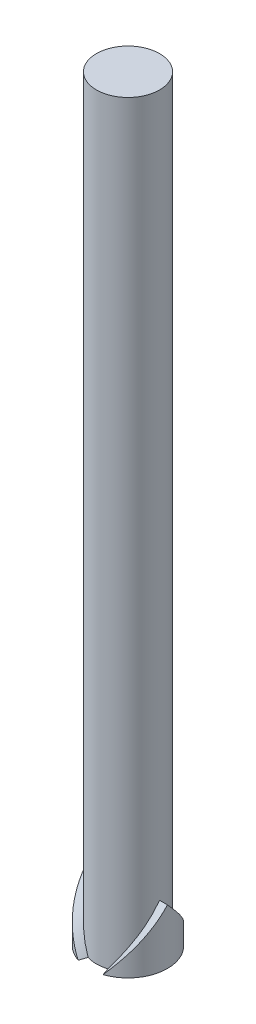
ISO-10303-21;
HEADER;
FILE_DESCRIPTION(('STEP AP214'),'2;1');
FILE_NAME('part.step','',(''),(''),'','','');
FILE_SCHEMA(('AUTOMOTIVE_DESIGN { 1 0 10303 214 1 1 1 1 }'));
ENDSEC;
DATA;
#1=APPLICATION_CONTEXT('core data for automotive mechanical design processes');
#2=APPLICATION_PROTOCOL_DEFINITION('international standard','automotive_design',2000,#1);
#3=PRODUCT_CONTEXT('',#1,'mechanical');
#4=PRODUCT('Part','Part','',(#3));
#5=PRODUCT_RELATED_PRODUCT_CATEGORY('part','',(#4));
#6=PRODUCT_DEFINITION_FORMATION('','',#4);
#7=PRODUCT_DEFINITION_CONTEXT('part definition',#1,'design');
#8=PRODUCT_DEFINITION('design','',#6,#7);
#9=PRODUCT_DEFINITION_SHAPE('','',#8);
#10=(LENGTH_UNIT() NAMED_UNIT(*) SI_UNIT(.MILLI.,.METRE.));
#11=(NAMED_UNIT(*) PLANE_ANGLE_UNIT() SI_UNIT($,.RADIAN.));
#12=(NAMED_UNIT(*) SI_UNIT($,.STERADIAN.) SOLID_ANGLE_UNIT());
#13=UNCERTAINTY_MEASURE_WITH_UNIT(LENGTH_MEASURE(1.E-05),#10,'distance_accuracy_value','');
#14=(GEOMETRIC_REPRESENTATION_CONTEXT(3) GLOBAL_UNCERTAINTY_ASSIGNED_CONTEXT((#13)) GLOBAL_UNIT_ASSIGNED_CONTEXT((#10,
#11,#12)) REPRESENTATION_CONTEXT('',''));
#15=CARTESIAN_POINT('',(0.,0.,0.));
#16=DIRECTION('',(0.,0.,1.));
#17=DIRECTION('',(1.,0.,0.));
#18=AXIS2_PLACEMENT_3D('',#15,#16,#17);
#19=CARTESIAN_POINT('',(0.,1219.2,0.));
#20=DIRECTION('',(0.,-1.,0.));
#21=DIRECTION('',(0.,0.,-1.));
#22=AXIS2_PLACEMENT_3D('',#19,#20,#21);
#23=CYLINDRICAL_SURFACE('',#22,50.8);
#24=CARTESIAN_POINT('',(0.,1219.2,0.));
#25=DIRECTION('',(0.,1.,0.));
#26=DIRECTION('',(0.,0.,1.));
#27=AXIS2_PLACEMENT_3D('',#24,#25,#26);
#28=CIRCLE('',#27,50.8);
#29=CARTESIAN_POINT('',(0.,1219.2,50.8));
#30=VERTEX_POINT('',#29);
#31=EDGE_CURVE('E13',#30,#30,#28,.T.);
#32=ORIENTED_EDGE('',*,*,#31,.F.);
#33=EDGE_LOOP('',(#32));
#34=FACE_BOUND('',#33,.T.);
#35=CARTESIAN_POINT('',(-50.8,88.8999997493691,-1.79023148921436E-07));
#36=CARTESIAN_POINT('',(-50.7999999813513,81.4914848887702,-5.29179650802243));
#37=CARTESIAN_POINT('',(-49.9665138679449,74.0833331244744,-10.5824962951891));
#38=CARTESIAN_POINT('',(-46.7127895711913,59.2666664995797,-20.6532570417071));
#39=CARTESIAN_POINT('',(-44.2930661533012,51.8583331871324,-25.4315950481385));
#40=CARTESIAN_POINT('',(-38.1007866836825,37.0416665622376,-34.0142880277942));
#41=CARTESIAN_POINT('',(-34.329210300567,29.6333332497901,-37.8172851496861));
#42=CARTESIAN_POINT('',(-25.7981852566743,14.8166666248953,-44.0805555025743));
#43=CARTESIAN_POINT('',(-21.0402093346618,7.40851486059984,-46.5397969434894));
#44=CARTESIAN_POINT('',(-16.018376009679,6.66133814775094E-13,-48.208418663264));
#45=B_SPLINE_CURVE_WITH_KNOTS('',3,(#35,#36,#37,#38,#39,#40,#41,#42,#43,#44),.UNSPECIFIED.,.F.,
.F.,(4,2,2,2,4),(0.,0.249999999295187,0.499999998590374,0.749999997885561,0.999999997180749),.UNSPECIFIED.);
#46=CARTESIAN_POINT('',(-16.018376009679,0.,-48.208418663264));
#47=VERTEX_POINT('',#46);
#48=CARTESIAN_POINT('',(-50.8,88.8999997493691,-1.79023148921436E-07));
#49=VERTEX_POINT('',#48);
#50=EDGE_CURVE('E100',#47,#49,#45,.F.);
#51=ORIENTED_EDGE('',*,*,#50,.T.);
#52=CARTESIAN_POINT('',(-16.0183760096803,6.66133814775094E-13,48.2084186632636));
#53=CARTESIAN_POINT('',(-21.0402093488223,7.40851488148833,46.5397969387841));
#54=CARTESIAN_POINT('',(-25.7981852834857,14.8166666666673,44.0805554886739));
#55=CARTESIAN_POINT('',(-34.3292103459112,29.6333333333339,37.8172851106117));
#56=CARTESIAN_POINT('',(-38.1007867348889,37.0416666666675,34.0142879727567));
#57=CARTESIAN_POINT('',(-44.293066206842,51.8583333333341,25.4315949579931));
#58=CARTESIAN_POINT('',(-46.7127896211929,59.2666666666674,20.6532569324376));
#59=CARTESIAN_POINT('',(-49.9665139005018,74.083333333334,10.5824961489277));
#60=CARTESIAN_POINT('',(-50.8000000000001,81.491485118513,5.29179634391905));
#61=CARTESIAN_POINT('',(-50.8,88.9000000000006,-7.12579610922759E-13));
#62=B_SPLINE_CURVE_WITH_KNOTS('',3,(#52,#53,#54,#55,#56,#57,#58,#59,#60,#61),.UNSPECIFIED.,.F.,
.F.,(4,2,2,2,4),(0.,0.25,0.5,0.75,1.),.UNSPECIFIED.);
#63=CARTESIAN_POINT('',(-16.0183760096803,0.,48.2084186632636));
#64=VERTEX_POINT('',#63);
#65=EDGE_CURVE('E146',#49,#64,#62,.F.);
#66=ORIENTED_EDGE('',*,*,#65,.T.);
#67=CARTESIAN_POINT('',(0.,0.,0.));
#68=DIRECTION('',(0.,1.,0.));
#69=DIRECTION('',(0.,0.,1.));
#70=AXIS2_PLACEMENT_3D('',#67,#68,#69);
#71=CIRCLE('',#70,50.8);
#72=CARTESIAN_POINT('',(16.0183760096796,0.,48.2084186632638));
#73=VERTEX_POINT('',#72);
#74=EDGE_CURVE('E363',#64,#73,#71,.T.);
#75=ORIENTED_EDGE('',*,*,#74,.T.);
#76=CARTESIAN_POINT('',(50.8,88.9000000000006,0.));
#77=CARTESIAN_POINT('',(50.8,81.491485118513,5.29179634391977));
#78=CARTESIAN_POINT('',(49.9665139005017,74.083333333334,10.5824961489284));
#79=CARTESIAN_POINT('',(46.7127896211926,59.2666666666674,20.6532569324382));
#80=CARTESIAN_POINT('',(44.2930662068417,51.8583333333341,25.4315949579937));
#81=CARTESIAN_POINT('',(38.1007867348885,37.0416666666675,34.0142879727573));
#82=CARTESIAN_POINT('',(34.3292103459107,29.6333333333339,37.8172851106122));
#83=CARTESIAN_POINT('',(25.798185283485,14.8166666666673,44.0805554886742));
#84=CARTESIAN_POINT('',(21.0402093488216,7.40851488148834,46.5397969387844));
#85=CARTESIAN_POINT('',(16.0183760096796,6.66133814775094E-13,48.2084186632638));
#86=B_SPLINE_CURVE_WITH_KNOTS('',3,(#76,#77,#78,#79,#80,#81,#82,#83,#84,#85),.UNSPECIFIED.,.F.,
.F.,(4,2,2,2,4),(0.,0.25,0.5,0.75,1.),.UNSPECIFIED.);
#87=CARTESIAN_POINT('',(50.8,88.8999997493691,-1.79022484571891E-07));
#88=VERTEX_POINT('',#87);
#89=EDGE_CURVE('E272',#88,#73,#86,.T.);
#90=ORIENTED_EDGE('',*,*,#89,.F.);
#91=CARTESIAN_POINT('',(16.0183760096796,6.66133814775094E-13,-48.2084186632638));
#92=CARTESIAN_POINT('',(21.0402093346625,7.40851486059991,-46.5397969434891));
#93=CARTESIAN_POINT('',(25.7981852566749,14.8166666248953,-44.080555502574));
#94=CARTESIAN_POINT('',(34.3292103005675,29.6333332497901,-37.8172851496856));
#95=CARTESIAN_POINT('',(38.100786683683,37.0416665622376,-34.0142880277937));
#96=CARTESIAN_POINT('',(44.2930661533016,51.8583331871324,-25.4315950481379));
#97=CARTESIAN_POINT('',(46.7127895711916,59.2666664995797,-20.6532570417064));
#98=CARTESIAN_POINT('',(49.9665138679451,74.0833331244744,-10.5824962951884));
#99=CARTESIAN_POINT('',(50.7999999813514,81.4914848887702,-5.29179650802174));
#100=CARTESIAN_POINT('',(50.8,88.8999997493691,-1.79022484571891E-07));
#101=B_SPLINE_CURVE_WITH_KNOTS('',3,(#91,#92,#93,#94,#95,#96,#97,#98,#99,#100),.UNSPECIFIED.,
.F.,.F.,(4,2,2,2,4),(0.,0.249999999295187,0.499999998590374,0.749999997885561,
0.999999997180748),.UNSPECIFIED.);
#102=CARTESIAN_POINT('',(16.0183760096796,0.,-48.2084186632638));
#103=VERTEX_POINT('',#102);
#104=EDGE_CURVE('E424',#103,#88,#101,.T.);
#105=ORIENTED_EDGE('',*,*,#104,.F.);
#106=EDGE_CURVE('E92',#103,#47,#71,.T.);
#107=ORIENTED_EDGE('',*,*,#106,.T.);
#108=EDGE_LOOP('',(#51,#66,#75,#90,#105,#107));
#109=FACE_BOUND('',#108,.T.);
#110=ADVANCED_FACE('F82',(#34,#109),#23,.T.);
#111=CARTESIAN_POINT('',(0.,1219.2,0.));
#112=DIRECTION('',(0.,1.,0.));
#113=DIRECTION('',(0.,0.,1.));
#114=AXIS2_PLACEMENT_3D('',#111,#112,#113);
#115=PLANE('',#114);
#116=ORIENTED_EDGE('',*,*,#31,.T.);
#117=EDGE_LOOP('',(#116));
#118=FACE_BOUND('',#117,.T.);
#119=ADVANCED_FACE('F315',(#118),#115,.T.);
#120=CARTESIAN_POINT('',(0.,0.,0.));
#121=DIRECTION('',(0.,1.,0.));
#122=DIRECTION('',(0.,0.,1.));
#123=AXIS2_PLACEMENT_3D('',#120,#121,#122);
#124=PLANE('',#123);
#125=ORIENTED_EDGE('',*,*,#106,.F.);
#126=CARTESIAN_POINT('',(20.0229700120995,5.55111512312578E-13,-60.2605233290797));
#127=CARTESIAN_POINT('',(16.0183760096796,6.66133814775094E-13,-48.2084186632638));
#128=B_SPLINE_CURVE_WITH_KNOTS('',1,(#126,#127),.UNSPECIFIED.,.F.,.F.,(2,2),(0.,1.),.UNSPECIFIED.);
#129=CARTESIAN_POINT('',(20.0229700120995,4.44089209850063E-13,-60.2605233290797));
#130=VERTEX_POINT('',#129);
#131=EDGE_CURVE('E349',#103,#130,#128,.F.);
#132=ORIENTED_EDGE('',*,*,#131,.T.);
#133=CARTESIAN_POINT('',(0.,4.44089209850063E-13,0.));
#134=DIRECTION('',(0.,-1.,0.));
#135=DIRECTION('',(0.,0.,-1.));
#136=AXIS2_PLACEMENT_3D('',#133,#134,#135);
#137=CIRCLE('',#136,63.5);
#138=CARTESIAN_POINT('',(20.0229700120996,4.44089209850063E-13,60.2605233290797));
#139=VERTEX_POINT('',#138);
#140=EDGE_CURVE('E264',#139,#130,#137,.F.);
#141=ORIENTED_EDGE('',*,*,#140,.F.);
#142=CARTESIAN_POINT('',(16.0183760096796,6.66133814775094E-13,48.2084186632638));
#143=CARTESIAN_POINT('',(20.0229700120996,5.55111512312578E-13,60.2605233290797));
#144=B_SPLINE_CURVE_WITH_KNOTS('',1,(#142,#143),.UNSPECIFIED.,.F.,.F.,(2,2),(0.,1.),.UNSPECIFIED.);
#145=EDGE_CURVE('E413',#73,#139,#144,.T.);
#146=ORIENTED_EDGE('',*,*,#145,.F.);
#147=ORIENTED_EDGE('',*,*,#74,.F.);
#148=CARTESIAN_POINT('',(-20.0229700121004,5.55111512312578E-13,60.2605233290794));
#149=CARTESIAN_POINT('',(-16.0183760096803,6.66133814775094E-13,48.2084186632636));
#150=B_SPLINE_CURVE_WITH_KNOTS('',1,(#148,#149),.UNSPECIFIED.,.F.,.F.,(2,2),(0.,1.),.UNSPECIFIED.);
#151=CARTESIAN_POINT('',(-20.0229700121004,4.44089209850063E-13,60.2605233290794));
#152=VERTEX_POINT('',#151);
#153=EDGE_CURVE('E150',#64,#152,#150,.F.);
#154=ORIENTED_EDGE('',*,*,#153,.T.);
#155=CARTESIAN_POINT('',(0.,4.44089209850063E-13,0.));
#156=DIRECTION('',(0.,-1.,0.));
#157=DIRECTION('',(0.,0.,-1.));
#158=AXIS2_PLACEMENT_3D('',#155,#156,#157);
#159=CIRCLE('',#158,63.5);
#160=CARTESIAN_POINT('',(-20.0229700120987,4.44089209850063E-13,-60.26052332908));
#161=VERTEX_POINT('',#160);
#162=EDGE_CURVE('E163',#161,#152,#159,.F.);
#163=ORIENTED_EDGE('',*,*,#162,.F.);
#164=CARTESIAN_POINT('',(-16.018376009679,6.66133814775094E-13,-48.208418663264));
#165=CARTESIAN_POINT('',(-20.0229700120987,5.55111512312578E-13,-60.26052332908));
#166=B_SPLINE_CURVE_WITH_KNOTS('',1,(#164,#165),.UNSPECIFIED.,.F.,.F.,(2,2),(0.,1.),.UNSPECIFIED.);
#167=EDGE_CURVE('E151',#47,#161,#166,.T.);
#168=ORIENTED_EDGE('',*,*,#167,.F.);
#169=EDGE_LOOP('',(#125,#132,#141,#146,#147,#154,#163,#168));
#170=FACE_BOUND('',#169,.T.);
#171=ADVANCED_FACE('F390',(#170),#124,.F.);
#172=CARTESIAN_POINT('',(63.5,88.9000000000005,0.));
#173=CARTESIAN_POINT('',(63.5,81.491428296131,6.61479616416919));
#174=CARTESIAN_POINT('',(62.4581423756271,74.0833333333339,13.2281201861605));
#175=CARTESIAN_POINT('',(58.3909870264908,59.2666666666673,25.8165711655478));
#176=CARTESIAN_POINT('',(55.3663327585521,51.858333333334,31.7894936974921));
#177=CARTESIAN_POINT('',(47.6259834186106,37.0416666666673,42.5178599659466));
#178=CARTESIAN_POINT('',(42.9115129323884,29.6333333333338,47.2716063882652));
#179=CARTESIAN_POINT('',(32.2477316043563,14.8166666666672,55.1006943608428));
#180=CARTESIAN_POINT('',(26.3003098320685,7.40857170387009,58.1747301758307));
#181=CARTESIAN_POINT('',(20.0229700120996,5.55111512312578E-13,60.2605233290797));
#182=CARTESIAN_POINT('',(50.8,88.9000000000006,0.));
#183=CARTESIAN_POINT('',(50.8,81.491485118513,5.29179634391977));
#184=CARTESIAN_POINT('',(49.9665139005017,74.083333333334,10.5824961489284));
#185=CARTESIAN_POINT('',(46.7127896211926,59.2666666666674,20.6532569324382));
#186=CARTESIAN_POINT('',(44.2930662068417,51.8583333333341,25.4315949579937));
#187=CARTESIAN_POINT('',(38.1007867348885,37.0416666666675,34.0142879727573));
#188=CARTESIAN_POINT('',(34.3292103459107,29.6333333333339,37.8172851106122));
#189=CARTESIAN_POINT('',(25.798185283485,14.8166666666673,44.0805554886742));
#190=CARTESIAN_POINT('',(21.0402093488216,7.40851488148834,46.5397969387844));
#191=CARTESIAN_POINT('',(16.0183760096796,6.66133814775094E-13,48.2084186632638));
#192=B_SPLINE_SURFACE_WITH_KNOTS('',1,3,((#172,#173,#174,#175,#176,#177,#178,#179,#180,#181),
(#182,#183,#184,#185,#186,#187,#188,#189,#190,#191)),.UNSPECIFIED.,.F.,.F.,.F.,(2,2),(4,2,2,2,
4),(0.,1.),(0.,0.25,0.5,0.75,1.),.UNSPECIFIED.);
#193=CARTESIAN_POINT('',(50.8,88.8999997493691,-1.79022484571891E-07));
#194=CARTESIAN_POINT('',(63.5,88.899999749369,-2.23778105714864E-07));
#195=B_SPLINE_CURVE_WITH_KNOTS('',1,(#193,#194),.UNSPECIFIED.,.F.,.F.,(2,2),(0.,1.),.UNSPECIFIED.);
#196=CARTESIAN_POINT('',(63.5,88.9000000000011,0.));
#197=VERTEX_POINT('',#196);
#198=EDGE_CURVE('E340',#88,#197,#195,.T.);
#199=CARTESIAN_POINT('',(20.0229700120996,5.55111512312578E-13,60.2605233290797));
#200=CARTESIAN_POINT('',(26.3003098320685,7.40857170387009,58.1747301758307));
#201=CARTESIAN_POINT('',(32.2477316043563,14.8166666666672,55.1006943608428));
#202=CARTESIAN_POINT('',(42.9115129323884,29.6333333333338,47.2716063882652));
#203=CARTESIAN_POINT('',(47.6259834186106,37.0416666666673,42.5178599659466));
#204=CARTESIAN_POINT('',(55.3663327585521,51.858333333334,31.7894936974921));
#205=CARTESIAN_POINT('',(58.3909870264908,59.2666666666673,25.8165711655478));
#206=CARTESIAN_POINT('',(62.4581423756271,74.0833333333339,13.2281201861605));
#207=CARTESIAN_POINT('',(63.5,81.491428296131,6.61479616416919));
#208=CARTESIAN_POINT('',(63.5,88.9000000000005,0.));
#209=B_SPLINE_CURVE_WITH_KNOTS('',3,(#199,#200,#201,#202,#203,#204,#205,#206,#207,#208),
.UNSPECIFIED.,.F.,.F.,(4,2,2,2,4),(0.,0.25,0.5,0.75,1.),.UNSPECIFIED.);
#210=EDGE_CURVE('E240',#197,#139,#209,.F.);
#211=ORIENTED_EDGE('',*,*,#198,.F.);
#212=ORIENTED_EDGE('',*,*,#89,.T.);
#213=ORIENTED_EDGE('',*,*,#145,.T.);
#214=ORIENTED_EDGE('',*,*,#210,.F.);
#215=EDGE_LOOP('',(#211,#212,#213,#214));
#216=FACE_BOUND('',#215,.T.);
#217=ADVANCED_FACE('F255',(#216),#192,.T.);
#218=CARTESIAN_POINT('',(20.0229700120995,5.55111512312578E-13,-60.2605233290797));
#219=CARTESIAN_POINT('',(26.3003098143688,7.40857168298083,-58.1747301817119));
#220=CARTESIAN_POINT('',(32.2477315708436,14.8166666248952,-55.1006943782175));
#221=CARTESIAN_POINT('',(42.9115128757094,29.63333324979,-47.2716064371071));
#222=CARTESIAN_POINT('',(47.6259833546037,37.0416665622375,-42.5178600347421));
#223=CARTESIAN_POINT('',(55.366332691627,51.8583331871323,-31.7894938101724));
#224=CARTESIAN_POINT('',(58.3909869639895,59.2666664995796,-25.8165713021331));
#225=CARTESIAN_POINT('',(62.4581423349314,74.0833331244743,-13.2281203689855));
#226=CARTESIAN_POINT('',(63.499999976689,81.491428066389,-6.614796369296));
#227=CARTESIAN_POINT('',(63.5,88.899999749369,-2.23778105714864E-07));
#228=CARTESIAN_POINT('',(16.0183760096796,6.66133814775094E-13,-48.2084186632638));
#229=CARTESIAN_POINT('',(21.0402093346625,7.40851486059991,-46.5397969434891));
#230=CARTESIAN_POINT('',(25.7981852566749,14.8166666248953,-44.080555502574));
#231=CARTESIAN_POINT('',(34.3292103005675,29.6333332497901,-37.8172851496856));
#232=CARTESIAN_POINT('',(38.100786683683,37.0416665622376,-34.0142880277937));
#233=CARTESIAN_POINT('',(44.2930661533016,51.8583331871324,-25.4315950481379));
#234=CARTESIAN_POINT('',(46.7127895711916,59.2666664995797,-20.6532570417064));
#235=CARTESIAN_POINT('',(49.9665138679451,74.0833331244744,-10.5824962951884));
#236=CARTESIAN_POINT('',(50.7999999813514,81.4914848887702,-5.29179650802174));
#237=CARTESIAN_POINT('',(50.8,88.8999997493691,-1.79022484571891E-07));
#238=B_SPLINE_SURFACE_WITH_KNOTS('',1,3,((#218,#219,#220,#221,#222,#223,#224,#225,#226,#227),
(#228,#229,#230,#231,#232,#233,#234,#235,#236,#237)),.UNSPECIFIED.,.F.,.F.,.F.,(2,2),(4,2,2,2,
4),(0.,1.),(0.,0.249999999295187,0.499999998590374,0.749999997885561,0.999999997180748),.UNSPECIFIED.);
#239=CARTESIAN_POINT('',(63.5,88.899999749369,-2.23778105714864E-07));
#240=CARTESIAN_POINT('',(63.499999976689,81.491428066389,-6.614796369296));
#241=CARTESIAN_POINT('',(62.4581423349314,74.0833331244743,-13.2281203689855));
#242=CARTESIAN_POINT('',(58.3909869639895,59.2666664995796,-25.8165713021331));
#243=CARTESIAN_POINT('',(55.366332691627,51.8583331871323,-31.7894938101724));
#244=CARTESIAN_POINT('',(47.6259833546037,37.0416665622375,-42.5178600347421));
#245=CARTESIAN_POINT('',(42.9115128757094,29.63333324979,-47.2716064371071));
#246=CARTESIAN_POINT('',(32.2477315708436,14.8166666248952,-55.1006943782175));
#247=CARTESIAN_POINT('',(26.3003098143688,7.40857168298083,-58.1747301817119));
#248=CARTESIAN_POINT('',(20.0229700120995,5.55111512312578E-13,-60.2605233290797));
#249=B_SPLINE_CURVE_WITH_KNOTS('',3,(#239,#240,#241,#242,#243,#244,#245,#246,#247,#248),
.UNSPECIFIED.,.F.,.F.,(4,2,2,2,4),(0.,0.249999999295187,0.499999998590374,0.749999997885561,
0.999999997180748),.UNSPECIFIED.);
#250=EDGE_CURVE('E271',#130,#197,#249,.F.);
#251=ORIENTED_EDGE('',*,*,#104,.T.);
#252=ORIENTED_EDGE('',*,*,#198,.T.);
#253=ORIENTED_EDGE('',*,*,#250,.F.);
#254=ORIENTED_EDGE('',*,*,#131,.F.);
#255=EDGE_LOOP('',(#251,#252,#253,#254));
#256=FACE_BOUND('',#255,.T.);
#257=ADVANCED_FACE('F254',(#256),#238,.T.);
#258=CARTESIAN_POINT('',(0.,1219.2,0.));
#259=DIRECTION('',(0.,-1.,0.));
#260=DIRECTION('',(0.,0.,-1.));
#261=AXIS2_PLACEMENT_3D('',#258,#259,#260);
#262=CYLINDRICAL_SURFACE('',#261,63.5);
#263=ORIENTED_EDGE('',*,*,#140,.T.);
#264=ORIENTED_EDGE('',*,*,#250,.T.);
#265=ORIENTED_EDGE('',*,*,#210,.T.);
#266=EDGE_LOOP('',(#263,#264,#265));
#267=FACE_BOUND('',#266,.T.);
#268=ADVANCED_FACE('F245',(#267),#262,.T.);
#269=CARTESIAN_POINT('',(-63.5,88.9000000000005,-8.90724513653449E-13));
#270=CARTESIAN_POINT('',(-63.5000000000001,81.491428296131,6.61479616416836));
#271=CARTESIAN_POINT('',(-62.4581423756273,74.0833333333339,13.2281201861597));
#272=CARTESIAN_POINT('',(-58.3909870264911,59.2666666666673,25.816571165547));
#273=CARTESIAN_POINT('',(-55.3663327585526,51.858333333334,31.7894936974914));
#274=CARTESIAN_POINT('',(-47.6259834186112,37.0416666666673,42.5178599659459));
#275=CARTESIAN_POINT('',(-42.911512932389,29.6333333333338,47.2716063882646));
#276=CARTESIAN_POINT('',(-32.2477316043571,14.8166666666672,55.1006943608423));
#277=CARTESIAN_POINT('',(-26.3003098320693,7.40857170387006,58.1747301758304));
#278=CARTESIAN_POINT('',(-20.0229700121004,5.55111512312578E-13,60.2605233290794));
#279=CARTESIAN_POINT('',(-50.8,88.9000000000006,-7.12579610922759E-13));
#280=CARTESIAN_POINT('',(-50.8000000000001,81.491485118513,5.29179634391905));
#281=CARTESIAN_POINT('',(-49.9665139005018,74.083333333334,10.5824961489277));
#282=CARTESIAN_POINT('',(-46.7127896211929,59.2666666666674,20.6532569324376));
#283=CARTESIAN_POINT('',(-44.293066206842,51.8583333333341,25.4315949579931));
#284=CARTESIAN_POINT('',(-38.1007867348889,37.0416666666675,34.0142879727567));
#285=CARTESIAN_POINT('',(-34.3292103459112,29.6333333333339,37.8172851106117));
#286=CARTESIAN_POINT('',(-25.7981852834857,14.8166666666673,44.0805554886739));
#287=CARTESIAN_POINT('',(-21.0402093488223,7.40851488148833,46.5397969387841));
#288=CARTESIAN_POINT('',(-16.0183760096803,6.66133814775094E-13,48.2084186632636));
#289=B_SPLINE_SURFACE_WITH_KNOTS('',1,3,((#269,#270,#271,#272,#273,#274,#275,#276,#277,#278),
(#279,#280,#281,#282,#283,#284,#285,#286,#287,#288)),.UNSPECIFIED.,.F.,.F.,.F.,(2,2),(4,2,2,2,
4),(0.,1.),(0.,0.25,0.5,0.75,1.),.UNSPECIFIED.);
#290=CARTESIAN_POINT('',(-50.8,88.9000000000006,-7.12579610922759E-13));
#291=CARTESIAN_POINT('',(-63.5,88.9000000000005,-8.90724513653449E-13));
#292=B_SPLINE_CURVE_WITH_KNOTS('',1,(#290,#291),.UNSPECIFIED.,.F.,.F.,(2,2),(0.,1.),.UNSPECIFIED.);
#293=CARTESIAN_POINT('',(-63.5,88.9000000000011,-8.90724513653449E-13));
#294=VERTEX_POINT('',#293);
#295=EDGE_CURVE('E138',#49,#294,#292,.T.);
#296=CARTESIAN_POINT('',(-63.5,88.9000000000005,-8.90724513653449E-13));
#297=CARTESIAN_POINT('',(-63.5000000000001,81.491428296131,6.61479616416836));
#298=CARTESIAN_POINT('',(-62.4581423756273,74.0833333333339,13.2281201861597));
#299=CARTESIAN_POINT('',(-58.3909870264911,59.2666666666673,25.816571165547));
#300=CARTESIAN_POINT('',(-55.3663327585526,51.858333333334,31.7894936974914));
#301=CARTESIAN_POINT('',(-47.6259834186112,37.0416666666673,42.5178599659459));
#302=CARTESIAN_POINT('',(-42.911512932389,29.6333333333338,47.2716063882646));
#303=CARTESIAN_POINT('',(-32.2477316043571,14.8166666666672,55.1006943608423));
#304=CARTESIAN_POINT('',(-26.3003098320693,7.40857170387006,58.1747301758304));
#305=CARTESIAN_POINT('',(-20.0229700121004,5.55111512312578E-13,60.2605233290794));
#306=B_SPLINE_CURVE_WITH_KNOTS('',3,(#296,#297,#298,#299,#300,#301,#302,#303,#304,#305),
.UNSPECIFIED.,.F.,.F.,(4,2,2,2,4),(0.,0.25,0.5,0.75,1.),.UNSPECIFIED.);
#307=EDGE_CURVE('E144',#294,#152,#306,.T.);
#308=ORIENTED_EDGE('',*,*,#153,.F.);
#309=ORIENTED_EDGE('',*,*,#65,.F.);
#310=ORIENTED_EDGE('',*,*,#295,.T.);
#311=ORIENTED_EDGE('',*,*,#307,.T.);
#312=EDGE_LOOP('',(#308,#309,#310,#311));
#313=FACE_BOUND('',#312,.T.);
#314=ADVANCED_FACE('F142',(#313),#289,.F.);
#315=CARTESIAN_POINT('',(-20.0229700120987,5.55111512312578E-13,-60.26052332908));
#316=CARTESIAN_POINT('',(-26.300309814368,7.40857168298077,-58.1747301817122));
#317=CARTESIAN_POINT('',(-32.2477315708428,14.8166666248952,-55.1006943782179));
#318=CARTESIAN_POINT('',(-42.9115128757087,29.63333324979,-47.2716064371077));
#319=CARTESIAN_POINT('',(-47.6259833546031,37.0416665622375,-42.5178600347428));
#320=CARTESIAN_POINT('',(-55.3663326916266,51.8583331871323,-31.7894938101732));
#321=CARTESIAN_POINT('',(-58.3909869639891,59.2666664995796,-25.8165713021338));
#322=CARTESIAN_POINT('',(-62.4581423349312,74.0833331244743,-13.2281203689863));
#323=CARTESIAN_POINT('',(-63.4999999766889,81.4914280663889,-6.61479636929689));
#324=CARTESIAN_POINT('',(-63.5,88.899999749369,-2.23778936151795E-07));
#325=CARTESIAN_POINT('',(-16.018376009679,6.66133814775094E-13,-48.208418663264));
#326=CARTESIAN_POINT('',(-21.0402093346618,7.40851486059984,-46.5397969434894));
#327=CARTESIAN_POINT('',(-25.7981852566743,14.8166666248953,-44.0805555025743));
#328=CARTESIAN_POINT('',(-34.329210300567,29.6333332497901,-37.8172851496861));
#329=CARTESIAN_POINT('',(-38.1007866836825,37.0416665622376,-34.0142880277942));
#330=CARTESIAN_POINT('',(-44.2930661533012,51.8583331871324,-25.4315950481385));
#331=CARTESIAN_POINT('',(-46.7127895711913,59.2666664995797,-20.6532570417071));
#332=CARTESIAN_POINT('',(-49.9665138679449,74.0833331244744,-10.5824962951891));
#333=CARTESIAN_POINT('',(-50.7999999813513,81.4914848887702,-5.29179650802243));
#334=CARTESIAN_POINT('',(-50.8,88.8999997493691,-1.79023148921436E-07));
#335=B_SPLINE_SURFACE_WITH_KNOTS('',1,3,((#315,#316,#317,#318,#319,#320,#321,#322,#323,#324),
(#325,#326,#327,#328,#329,#330,#331,#332,#333,#334)),.UNSPECIFIED.,.F.,.F.,.F.,(2,2),(4,2,2,2,
4),(0.,1.),(0.,0.249999999295187,0.499999998590374,0.749999997885561,0.999999997180749),.UNSPECIFIED.);
#336=CARTESIAN_POINT('',(-20.0229700120987,5.55111512312578E-13,-60.26052332908));
#337=CARTESIAN_POINT('',(-26.300309814368,7.40857168298077,-58.1747301817122));
#338=CARTESIAN_POINT('',(-32.2477315708428,14.8166666248952,-55.1006943782179));
#339=CARTESIAN_POINT('',(-42.9115128757087,29.63333324979,-47.2716064371077));
#340=CARTESIAN_POINT('',(-47.6259833546031,37.0416665622375,-42.5178600347428));
#341=CARTESIAN_POINT('',(-55.3663326916266,51.8583331871323,-31.7894938101732));
#342=CARTESIAN_POINT('',(-58.3909869639891,59.2666664995796,-25.8165713021338));
#343=CARTESIAN_POINT('',(-62.4581423349312,74.0833331244743,-13.2281203689863));
#344=CARTESIAN_POINT('',(-63.4999999766889,81.4914280663889,-6.61479636929689));
#345=CARTESIAN_POINT('',(-63.5,88.899999749369,-2.23778936151795E-07));
#346=B_SPLINE_CURVE_WITH_KNOTS('',3,(#336,#337,#338,#339,#340,#341,#342,#343,#344,#345),
.UNSPECIFIED.,.F.,.F.,(4,2,2,2,4),(0.,0.249999999295187,0.499999998590374,0.749999997885561,
0.999999997180749),.UNSPECIFIED.);
#347=EDGE_CURVE('E155',#161,#294,#346,.T.);
#348=ORIENTED_EDGE('',*,*,#295,.F.);
#349=ORIENTED_EDGE('',*,*,#50,.F.);
#350=ORIENTED_EDGE('',*,*,#167,.T.);
#351=ORIENTED_EDGE('',*,*,#347,.T.);
#352=EDGE_LOOP('',(#348,#349,#350,#351));
#353=FACE_BOUND('',#352,.T.);
#354=ADVANCED_FACE('F157',(#353),#335,.F.);
#355=CARTESIAN_POINT('',(0.,1219.2,0.));
#356=DIRECTION('',(0.,-1.,0.));
#357=DIRECTION('',(0.,0.,-1.));
#358=AXIS2_PLACEMENT_3D('',#355,#356,#357);
#359=CYLINDRICAL_SURFACE('',#358,63.5);
#360=ORIENTED_EDGE('',*,*,#347,.F.);
#361=ORIENTED_EDGE('',*,*,#162,.T.);
#362=ORIENTED_EDGE('',*,*,#307,.F.);
#363=EDGE_LOOP('',(#360,#361,#362));
#364=FACE_BOUND('',#363,.T.);
#365=ADVANCED_FACE('F167',(#364),#359,.T.);
#366=CLOSED_SHELL('',(#110,#119,#171,#217,#257,#268,#314,#354,#365));
#367=MANIFOLD_SOLID_BREP('B2',#366);
#368=ADVANCED_BREP_SHAPE_REPRESENTATION('',(#18,#367),#14);
#369=SHAPE_DEFINITION_REPRESENTATION(#9,#368);
ENDSEC;
END-ISO-10303-21;
